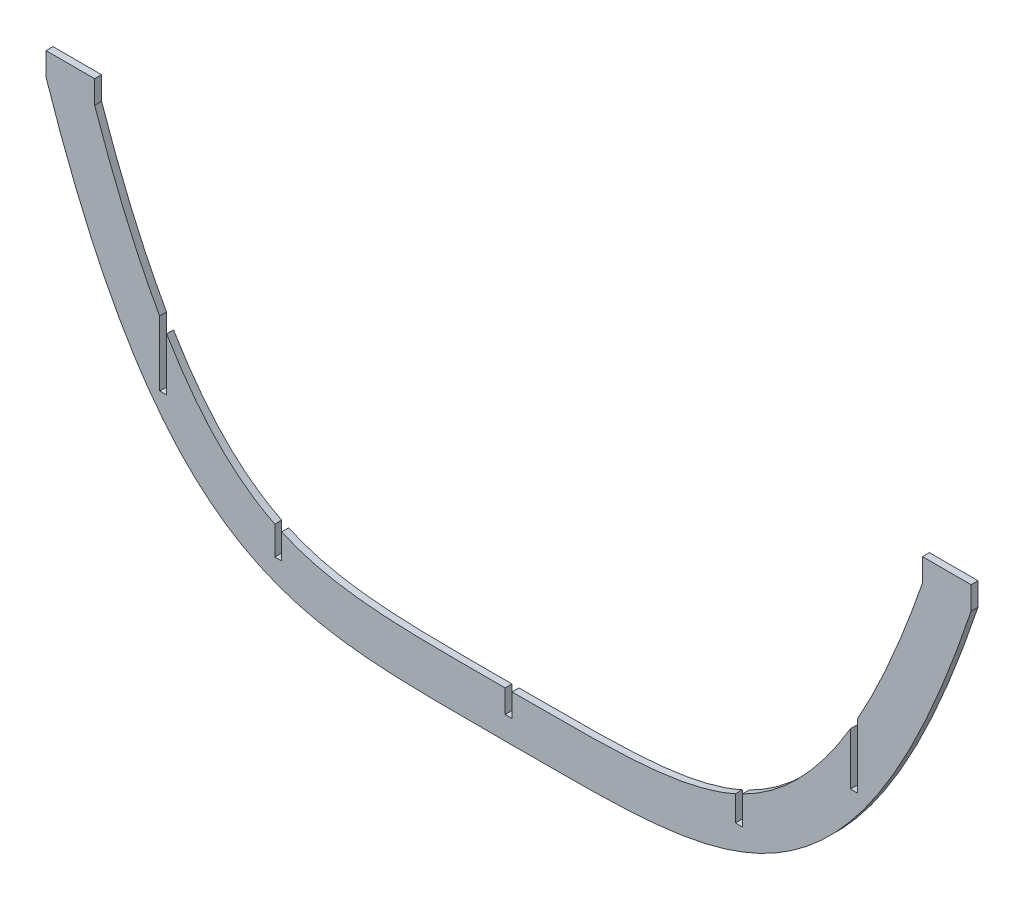
ISO-10303-21;
HEADER;
FILE_DESCRIPTION(('STEP AP214'),'2;1');
FILE_NAME('part.step','',(''),(''),'','','');
FILE_SCHEMA(('AUTOMOTIVE_DESIGN { 1 0 10303 214 1 1 1 1 }'));
ENDSEC;
DATA;
#1=APPLICATION_CONTEXT('core data for automotive mechanical design processes');
#2=APPLICATION_PROTOCOL_DEFINITION('international standard','automotive_design',2000,#1);
#3=PRODUCT_CONTEXT('',#1,'mechanical');
#4=PRODUCT('Part','Part','',(#3));
#5=PRODUCT_RELATED_PRODUCT_CATEGORY('part','',(#4));
#6=PRODUCT_DEFINITION_FORMATION('','',#4);
#7=PRODUCT_DEFINITION_CONTEXT('part definition',#1,'design');
#8=PRODUCT_DEFINITION('design','',#6,#7);
#9=PRODUCT_DEFINITION_SHAPE('','',#8);
#10=(LENGTH_UNIT() NAMED_UNIT(*) SI_UNIT(.MILLI.,.METRE.));
#11=(NAMED_UNIT(*) PLANE_ANGLE_UNIT() SI_UNIT($,.RADIAN.));
#12=(NAMED_UNIT(*) SI_UNIT($,.STERADIAN.) SOLID_ANGLE_UNIT());
#13=UNCERTAINTY_MEASURE_WITH_UNIT(LENGTH_MEASURE(1.E-05),#10,'distance_accuracy_value','');
#14=(GEOMETRIC_REPRESENTATION_CONTEXT(3) GLOBAL_UNCERTAINTY_ASSIGNED_CONTEXT((#13)) GLOBAL_UNIT_ASSIGNED_CONTEXT((#10,
#11,#12)) REPRESENTATION_CONTEXT('',''));
#15=CARTESIAN_POINT('',(0.,0.,0.));
#16=DIRECTION('',(0.,0.,1.));
#17=DIRECTION('',(1.,0.,0.));
#18=AXIS2_PLACEMENT_3D('',#15,#16,#17);
#19=CARTESIAN_POINT('',(-1.76484963795853E-08,20.0000268367312,3.));
#20=DIRECTION('',(0.,0.,-1.));
#21=DIRECTION('',(-1.,0.,0.));
#22=AXIS2_PLACEMENT_3D('',#19,#20,#21);
#23=PLANE('',#22);
#24=DIRECTION('',(0.,-1.,0.));
#25=VECTOR('',#24,1.);
#26=CARTESIAN_POINT('',(148.49999995567,20.0000268367312,3.));
#27=LINE('',#26,#25);
#28=CARTESIAN_POINT('',(148.499999955669,79.6816787201294,3.));
#29=VERTEX_POINT('',#28);
#30=CARTESIAN_POINT('',(148.49999995567,56.9497363309086,3.00000000000006));
#31=VERTEX_POINT('',#30);
#32=EDGE_CURVE('E231',#29,#31,#27,.T.);
#33=ORIENTED_EDGE('',*,*,#32,.F.);
#34=CARTESIAN_POINT('',(-181.89155674439,156.348940991431,3.));
#35=CARTESIAN_POINT('',(-181.389102539372,154.848010649401,3.));
#36=CARTESIAN_POINT('',(-180.365296683178,151.825275345379,3.));
#37=CARTESIAN_POINT('',(-178.341218670499,145.989784465338,3.));
#38=CARTESIAN_POINT('',(-175.809947010963,138.948890123025,3.));
#39=CARTESIAN_POINT('',(-172.785792832235,130.935125059408,3.));
#40=CARTESIAN_POINT('',(-168.767730488019,120.798325171274,3.));
#41=CARTESIAN_POINT('',(-163.77677392425,109.130604029288,3.));
#42=CARTESIAN_POINT('',(-157.84741355926,96.6329125765255,3.));
#43=CARTESIAN_POINT('',(-151.989218707979,85.5414270653508,3.));
#44=CARTESIAN_POINT('',(-144.288715251264,72.4973270246871,3.));
#45=CARTESIAN_POINT('',(-134.900658859617,59.2193290048783,3.));
#46=CARTESIAN_POINT('',(-124.086763070647,47.326306685615,3.));
#47=CARTESIAN_POINT('',(-113.706025746848,38.6442687840683,3.));
#48=CARTESIAN_POINT('',(-103.594307015774,32.3807774295716,3.));
#49=CARTESIAN_POINT('',(-93.4771216661665,27.8904041459694,3.));
#50=CARTESIAN_POINT('',(-83.0913857613406,24.726293951594,3.));
#51=CARTESIAN_POINT('',(-68.6850050786734,21.8783292872565,3.));
#52=CARTESIAN_POINT('',(-49.5163465659669,20.3042041838092,3.));
#53=CARTESIAN_POINT('',(-25.106587106077,19.9753145065531,3.));
#54=CARTESIAN_POINT('',(-1.77303726500037E-08,20.0123830018525,3.));
#55=CARTESIAN_POINT('',(25.1065870711075,19.9753145064242,3.));
#56=CARTESIAN_POINT('',(49.516346532462,20.3042041823506,3.));
#57=CARTESIAN_POINT('',(68.6850050471927,21.8783292829902,3.));
#58=CARTESIAN_POINT('',(83.0913857315635,24.7262939438739,3.));
#59=CARTESIAN_POINT('',(93.4771216374107,27.8904041349503,3.));
#60=CARTESIAN_POINT('',(103.594306987435,32.3807774142496,3.));
#61=CARTESIAN_POINT('',(113.706025718109,38.6442687629153,3.));
#62=CARTESIAN_POINT('',(124.086763040856,47.3263066565674,3.));
#63=CARTESIAN_POINT('',(134.900658828536,59.2193289656163,3.));
#64=CARTESIAN_POINT('',(144.288715219207,72.4973269750005,3.));
#65=CARTESIAN_POINT('',(151.989218675275,85.5414270062223,3.));
#66=CARTESIAN_POINT('',(157.84741352614,96.6329125097693,3.));
#67=CARTESIAN_POINT('',(163.776773890781,109.130603954358,3.));
#68=CARTESIAN_POINT('',(168.76773045431,120.798325089073,3.));
#69=CARTESIAN_POINT('',(172.785792798362,130.93512497111,3.));
#70=CARTESIAN_POINT('',(175.80994697698,138.948890030013,3.));
#71=CARTESIAN_POINT('',(178.341218636433,145.989784368273,3.));
#72=CARTESIAN_POINT('',(180.365296649052,151.825275245008,3.));
#73=CARTESIAN_POINT('',(181.389102505218,154.848010547339,3.));
#74=CARTESIAN_POINT('',(181.891556710222,156.348940888529,3.));
#75=B_SPLINE_CURVE_WITH_KNOTS('',3,(#34,#35,#36,#37,#38,#39,#40,#41,#42,#43,#44,#45,#46,#47,#48,
#49,#50,#51,#52,#53,#54,#55,#56,#57,#58,#59,#60,#61,#62,#63,#64,#65,#66,#67,#68,#69,#70,#71,#72,
#73,#74),.UNSPECIFIED.,.F.,.F.,(4,1,1,1,1,1,1,1,1,1,1,1,1,1,1,1,1,1,1,1,1,1,1,1,1,1,1,1,1,1,1,1,
1,1,1,1,1,1,4),(0.0367876297195018,0.0404064763620018,0.0440253230045017,0.0512630162895017,
0.0585007095745016,0.0657384028595015,0.0802137894295014,0.0946891759995013,0.109164562569501,
0.123639949139501,0.152590722279501,0.181541495419501,0.2104922685595,0.2394430416995,
0.2683938148395,0.2973445879795,0.326295361119499,0.384196907399499,0.442098453679498,
0.499999999959498,0.557901546239498,0.615803092519497,0.673704638799496,0.702655411939496,
0.731606185079496,0.760556958219496,0.789507731359496,0.818458504499495,0.847409277639495,
0.876360050779495,0.890835437349495,0.905310823919495,0.919786210489494,0.934261597059494,
0.941499290344494,0.948736983629494,0.955974676914494,0.959593523556994,0.963212370199494),.UNSPECIFIED.);
#76=CARTESIAN_POINT('',(101.49999995567,31.6009972758301,3.));
#77=VERTEX_POINT('',#76);
#78=EDGE_CURVE('E559',#77,#29,#75,.T.);
#79=ORIENTED_EDGE('',*,*,#78,.F.);
#80=DIRECTION('',(0.,1.,0.));
#81=VECTOR('',#80,1.);
#82=CARTESIAN_POINT('',(101.49999995567,20.0000268367312,3.));
#83=LINE('',#82,#81);
#84=CARTESIAN_POINT('',(101.49999995567,19.2159999834407,3.));
#85=VERTEX_POINT('',#84);
#86=EDGE_CURVE('E331',#85,#77,#83,.T.);
#87=ORIENTED_EDGE('',*,*,#86,.F.);
#88=DIRECTION('',(1.,0.,0.));
#89=VECTOR('',#88,1.);
#90=CARTESIAN_POINT('',(-1.76484963795853E-08,19.2159999834407,3.));
#91=LINE('',#90,#89);
#92=CARTESIAN_POINT('',(98.4999999556695,19.2159999834407,3.));
#93=VERTEX_POINT('',#92);
#94=EDGE_CURVE('E338',#93,#85,#91,.T.);
#95=ORIENTED_EDGE('',*,*,#94,.F.);
#96=DIRECTION('',(0.,-1.,0.));
#97=VECTOR('',#96,1.);
#98=CARTESIAN_POINT('',(98.4999999556695,20.0000268367312,3.));
#99=LINE('',#98,#97);
#100=CARTESIAN_POINT('',(98.4999999556695,30.1867286716392,3.));
#101=VERTEX_POINT('',#100);
#102=EDGE_CURVE('E341',#101,#93,#99,.T.);
#103=ORIENTED_EDGE('',*,*,#102,.F.);
#104=CARTESIAN_POINT('',(1.49999990680117,19.9999101597159,3.));
#105=VERTEX_POINT('',#104);
#106=EDGE_CURVE('E404',#105,#101,#75,.T.);
#107=ORIENTED_EDGE('',*,*,#106,.F.);
#108=DIRECTION('',(0.,1.,0.));
#109=VECTOR('',#108,1.);
#110=CARTESIAN_POINT('',(1.49999990680117,20.0000268367312,3.));
#111=LINE('',#110,#109);
#112=CARTESIAN_POINT('',(1.49999990680117,10.0000134183656,3.));
#113=VERTEX_POINT('',#112);
#114=EDGE_CURVE('E373',#113,#105,#111,.T.);
#115=ORIENTED_EDGE('',*,*,#114,.F.);
#116=DIRECTION('',(1.,0.,0.));
#117=VECTOR('',#116,1.);
#118=CARTESIAN_POINT('',(-1.76484963795853E-08,10.0000134183656,3.));
#119=LINE('',#118,#117);
#120=CARTESIAN_POINT('',(-1.49999999546217,10.0000134183656,3.));
#121=VERTEX_POINT('',#120);
#122=EDGE_CURVE('E363',#121,#113,#119,.T.);
#123=ORIENTED_EDGE('',*,*,#122,.F.);
#124=DIRECTION('',(0.,-1.,0.));
#125=VECTOR('',#124,1.);
#126=CARTESIAN_POINT('',(-1.49999999546217,20.0000268367312,3.));
#127=LINE('',#126,#125);
#128=CARTESIAN_POINT('',(-1.49999999546217,19.9999101597144,3.));
#129=VERTEX_POINT('',#128);
#130=EDGE_CURVE('E366',#129,#121,#127,.T.);
#131=ORIENTED_EDGE('',*,*,#130,.F.);
#132=CARTESIAN_POINT('',(-98.5000000000001,30.1867286962629,3.));
#133=VERTEX_POINT('',#132);
#134=EDGE_CURVE('E562',#133,#129,#75,.T.);
#135=ORIENTED_EDGE('',*,*,#134,.F.);
#136=DIRECTION('',(0.,1.,0.));
#137=VECTOR('',#136,1.);
#138=CARTESIAN_POINT('',(-98.5000000000001,20.0000268367312,3.));
#139=LINE('',#138,#137);
#140=CARTESIAN_POINT('',(-98.5000000000001,19.2160000001447,3.));
#141=VERTEX_POINT('',#140);
#142=EDGE_CURVE('E312',#141,#133,#139,.T.);
#143=ORIENTED_EDGE('',*,*,#142,.F.);
#144=DIRECTION('',(1.,0.,0.));
#145=VECTOR('',#144,1.);
#146=CARTESIAN_POINT('',(-1.76484963795853E-08,19.2160000001447,3.));
#147=LINE('',#146,#145);
#148=CARTESIAN_POINT('',(-101.5,19.2160000001447,3.));
#149=VERTEX_POINT('',#148);
#150=EDGE_CURVE('E315',#149,#141,#147,.T.);
#151=ORIENTED_EDGE('',*,*,#150,.F.);
#152=DIRECTION('',(0.,-1.,0.));
#153=VECTOR('',#152,1.);
#154=CARTESIAN_POINT('',(-101.5,20.0000268367312,3.));
#155=LINE('',#154,#153);
#156=CARTESIAN_POINT('',(-101.5,31.6009972982433,3.));
#157=VERTEX_POINT('',#156);
#158=EDGE_CURVE('E309',#157,#149,#155,.T.);
#159=ORIENTED_EDGE('',*,*,#158,.F.);
#160=CARTESIAN_POINT('',(-148.5,79.6816787949888,3.));
#161=VERTEX_POINT('',#160);
#162=EDGE_CURVE('E403',#161,#157,#75,.T.);
#163=ORIENTED_EDGE('',*,*,#162,.F.);
#164=DIRECTION('',(0.,1.,0.));
#165=VECTOR('',#164,1.);
#166=CARTESIAN_POINT('',(-148.5,20.0000268367312,3.));
#167=LINE('',#166,#165);
#168=CARTESIAN_POINT('',(-148.5,56.6560000001881,3.));
#169=VERTEX_POINT('',#168);
#170=EDGE_CURVE('E62',#169,#161,#167,.T.);
#171=ORIENTED_EDGE('',*,*,#170,.F.);
#172=DIRECTION('',(1.,0.,0.));
#173=VECTOR('',#172,1.);
#174=CARTESIAN_POINT('',(-1.76484963795853E-08,56.6560000001881,3.));
#175=LINE('',#174,#173);
#176=CARTESIAN_POINT('',(-151.5,56.6560000001881,3.));
#177=VERTEX_POINT('',#176);
#178=EDGE_CURVE('E288',#177,#169,#175,.T.);
#179=ORIENTED_EDGE('',*,*,#178,.F.);
#180=DIRECTION('',(0.,-1.,0.));
#181=VECTOR('',#180,1.);
#182=CARTESIAN_POINT('',(-151.5,20.0000268367312,3.));
#183=LINE('',#182,#181);
#184=CARTESIAN_POINT('',(-151.5,84.861233967771,3.));
#185=VERTEX_POINT('',#184);
#186=EDGE_CURVE('E285',#185,#177,#183,.T.);
#187=ORIENTED_EDGE('',*,*,#186,.F.);
#188=CARTESIAN_POINT('',(-179.730541016955,149.999999952136,3.));
#189=VERTEX_POINT('',#188);
#190=EDGE_CURVE('E395',#189,#185,#75,.T.);
#191=ORIENTED_EDGE('',*,*,#190,.F.);
#192=DIRECTION('',(0.,-1.,0.));
#193=VECTOR('',#192,1.);
#194=CARTESIAN_POINT('',(-179.730541016862,159.999999933328,3.));
#195=LINE('',#194,#193);
#196=CARTESIAN_POINT('',(-179.730541016862,159.999999933328,3.));
#197=VERTEX_POINT('',#196);
#198=EDGE_CURVE('E390',#197,#189,#195,.T.);
#199=ORIENTED_EDGE('',*,*,#198,.F.);
#200=DIRECTION('',(1.,0.,0.));
#201=VECTOR('',#200,1.);
#202=CARTESIAN_POINT('',(-200.857104713773,159.999999933328,3.));
#203=LINE('',#202,#201);
#204=CARTESIAN_POINT('',(-200.857104713773,159.999999933328,3.));
#205=VERTEX_POINT('',#204);
#206=EDGE_CURVE('E385',#205,#197,#203,.T.);
#207=ORIENTED_EDGE('',*,*,#206,.F.);
#208=DIRECTION('',(0.,1.,0.));
#209=VECTOR('',#208,1.);
#210=CARTESIAN_POINT('',(-200.857104713773,149.999999933328,3.));
#211=LINE('',#210,#209);
#212=CARTESIAN_POINT('',(-200.857104713153,149.999999931476,3.));
#213=VERTEX_POINT('',#212);
#214=EDGE_CURVE('E381',#213,#205,#211,.T.);
#215=ORIENTED_EDGE('',*,*,#214,.F.);
#216=CARTESIAN_POINT('',(-200.857104713153,149.999999931476,3.));
#217=CARTESIAN_POINT('',(-100.428552365603,-149.999999904114,3.));
#218=CARTESIAN_POINT('',(-1.80532342547446E-08,149.999999877385,3.));
#219=CARTESIAN_POINT('',(100.428552329497,-149.999999850558,3.));
#220=CARTESIAN_POINT('',(200.857104677046,149.999999822903,3.));
#221=B_SPLINE_CURVE_WITH_KNOTS('',4,(#216,#217,#218,#219,#220),.UNSPECIFIED.,.F.,.F.,(5,5),
(0.036787629720932,0.9632123701958),.UNSPECIFIED.);
#222=CARTESIAN_POINT('',(200.857104677046,149.999999822903,3.));
#223=VERTEX_POINT('',#222);
#224=EDGE_CURVE('E449',#213,#223,#221,.T.);
#225=ORIENTED_EDGE('',*,*,#224,.T.);
#226=DIRECTION('',(0.,1.,0.));
#227=VECTOR('',#226,1.);
#228=CARTESIAN_POINT('',(200.857104678648,149.999999827688,3.));
#229=LINE('',#228,#227);
#230=CARTESIAN_POINT('',(200.857104678648,159.999999832473,3.));
#231=VERTEX_POINT('',#230);
#232=EDGE_CURVE('E457',#223,#231,#229,.T.);
#233=ORIENTED_EDGE('',*,*,#232,.T.);
#234=DIRECTION('',(-1.,0.,0.));
#235=VECTOR('',#234,1.);
#236=CARTESIAN_POINT('',(200.857104678648,159.999999832473,3.));
#237=LINE('',#236,#235);
#238=CARTESIAN_POINT('',(179.730540975813,159.999999832473,3.));
#239=VERTEX_POINT('',#238);
#240=EDGE_CURVE('E631',#231,#239,#237,.T.);
#241=ORIENTED_EDGE('',*,*,#240,.T.);
#242=DIRECTION('',(0.,-1.,0.));
#243=VECTOR('',#242,1.);
#244=CARTESIAN_POINT('',(179.730540975813,159.999999832473,3.));
#245=LINE('',#244,#243);
#246=CARTESIAN_POINT('',(179.730540975813,149.999999832476,3.));
#247=VERTEX_POINT('',#246);
#248=EDGE_CURVE('E402',#239,#247,#245,.T.);
#249=ORIENTED_EDGE('',*,*,#248,.T.);
#250=CARTESIAN_POINT('',(151.49999995567,84.8612338884335,3.));
#251=VERTEX_POINT('',#250);
#252=EDGE_CURVE('E394',#251,#247,#75,.T.);
#253=ORIENTED_EDGE('',*,*,#252,.F.);
#254=DIRECTION('',(0.,1.,0.));
#255=VECTOR('',#254,1.);
#256=CARTESIAN_POINT('',(151.49999995567,20.0000268367312,3.));
#257=LINE('',#256,#255);
#258=CARTESIAN_POINT('',(151.49999995567,56.9497363309086,3.00000000000006));
#259=VERTEX_POINT('',#258);
#260=EDGE_CURVE('E54',#259,#251,#257,.T.);
#261=ORIENTED_EDGE('',*,*,#260,.F.);
#262=DIRECTION('',(1.,0.,0.));
#263=VECTOR('',#262,1.);
#264=CARTESIAN_POINT('',(-1.76484963795853E-08,56.9497363309086,3.));
#265=LINE('',#264,#263);
#266=EDGE_CURVE('E262',#31,#259,#265,.T.);
#267=ORIENTED_EDGE('',*,*,#266,.F.);
#268=EDGE_LOOP('',(#33,#79,#87,#95,#103,#107,#115,#123,#131,#135,#143,#151,#159,#163,#171,#179,
#187,#191,#199,#207,#215,#225,#233,#241,#249,#253,#261,#267));
#269=FACE_BOUND('',#268,.T.);
#270=ADVANCED_FACE('F38',(#269),#23,.F.);
#271=CARTESIAN_POINT('',(-1.76484963795853E-08,20.0000268367312,0.));
#272=DIRECTION('',(0.,0.,-1.));
#273=DIRECTION('',(-1.,0.,0.));
#274=AXIS2_PLACEMENT_3D('',#271,#272,#273);
#275=PLANE('',#274);
#276=CARTESIAN_POINT('',(-181.89155674439,156.348940991431,0.));
#277=CARTESIAN_POINT('',(-181.389102539372,154.848010649401,0.));
#278=CARTESIAN_POINT('',(-180.365296683178,151.825275345379,0.));
#279=CARTESIAN_POINT('',(-178.341218670499,145.989784465338,0.));
#280=CARTESIAN_POINT('',(-175.809947010963,138.948890123025,0.));
#281=CARTESIAN_POINT('',(-172.785792832235,130.935125059408,0.));
#282=CARTESIAN_POINT('',(-168.767730488019,120.798325171274,0.));
#283=CARTESIAN_POINT('',(-163.77677392425,109.130604029288,0.));
#284=CARTESIAN_POINT('',(-157.84741355926,96.6329125765255,0.));
#285=CARTESIAN_POINT('',(-151.989218707979,85.5414270653508,0.));
#286=CARTESIAN_POINT('',(-144.288715251264,72.4973270246871,0.));
#287=CARTESIAN_POINT('',(-134.900658859617,59.2193290048783,0.));
#288=CARTESIAN_POINT('',(-124.086763070647,47.326306685615,0.));
#289=CARTESIAN_POINT('',(-113.706025746848,38.6442687840683,0.));
#290=CARTESIAN_POINT('',(-103.594307015774,32.3807774295716,0.));
#291=CARTESIAN_POINT('',(-93.4771216661665,27.8904041459694,0.));
#292=CARTESIAN_POINT('',(-83.0913857613406,24.726293951594,0.));
#293=CARTESIAN_POINT('',(-68.6850050786734,21.8783292872565,0.));
#294=CARTESIAN_POINT('',(-49.5163465659669,20.3042041838092,0.));
#295=CARTESIAN_POINT('',(-25.106587106077,19.9753145065531,0.));
#296=CARTESIAN_POINT('',(-1.77303726500037E-08,20.0123830018525,0.));
#297=CARTESIAN_POINT('',(25.1065870711075,19.9753145064242,0.));
#298=CARTESIAN_POINT('',(49.516346532462,20.3042041823506,0.));
#299=CARTESIAN_POINT('',(68.6850050471927,21.8783292829902,0.));
#300=CARTESIAN_POINT('',(83.0913857315635,24.7262939438739,0.));
#301=CARTESIAN_POINT('',(93.4771216374107,27.8904041349503,0.));
#302=CARTESIAN_POINT('',(103.594306987435,32.3807774142496,0.));
#303=CARTESIAN_POINT('',(113.706025718109,38.6442687629153,0.));
#304=CARTESIAN_POINT('',(124.086763040856,47.3263066565674,0.));
#305=CARTESIAN_POINT('',(134.900658828536,59.2193289656163,0.));
#306=CARTESIAN_POINT('',(144.288715219207,72.4973269750005,0.));
#307=CARTESIAN_POINT('',(151.989218675275,85.5414270062223,0.));
#308=CARTESIAN_POINT('',(157.84741352614,96.6329125097693,0.));
#309=CARTESIAN_POINT('',(163.776773890781,109.130603954358,0.));
#310=CARTESIAN_POINT('',(168.76773045431,120.798325089073,0.));
#311=CARTESIAN_POINT('',(172.785792798362,130.93512497111,0.));
#312=CARTESIAN_POINT('',(175.80994697698,138.948890030013,0.));
#313=CARTESIAN_POINT('',(178.341218636433,145.989784368273,0.));
#314=CARTESIAN_POINT('',(180.365296649052,151.825275245008,0.));
#315=CARTESIAN_POINT('',(181.389102505218,154.848010547339,0.));
#316=CARTESIAN_POINT('',(181.891556710222,156.348940888529,0.));
#317=B_SPLINE_CURVE_WITH_KNOTS('',3,(#276,#277,#278,#279,#280,#281,#282,#283,#284,#285,#286,
#287,#288,#289,#290,#291,#292,#293,#294,#295,#296,#297,#298,#299,#300,#301,#302,#303,#304,#305,
#306,#307,#308,#309,#310,#311,#312,#313,#314,#315,#316),.UNSPECIFIED.,.F.,.F.,(4,1,1,1,1,1,1,1,
1,1,1,1,1,1,1,1,1,1,1,1,1,1,1,1,1,1,1,1,1,1,1,1,1,1,1,1,1,1,4),(0.0367876297195018,
0.0404064763620018,0.0440253230045017,0.0512630162895017,0.0585007095745016,0.0657384028595015,
0.0802137894295014,0.0946891759995013,0.109164562569501,0.123639949139501,0.152590722279501,
0.181541495419501,0.2104922685595,0.2394430416995,0.2683938148395,0.2973445879795,
0.326295361119499,0.384196907399499,0.442098453679498,0.499999999959498,0.557901546239498,
0.615803092519497,0.673704638799496,0.702655411939496,0.731606185079496,0.760556958219496,
0.789507731359496,0.818458504499495,0.847409277639495,0.876360050779495,0.890835437349495,
0.905310823919495,0.919786210489494,0.934261597059494,0.941499290344494,0.948736983629494,
0.955974676914494,0.959593523556994,0.963212370199494),.UNSPECIFIED.);
#318=CARTESIAN_POINT('',(101.499999955671,31.6009972758301,0.));
#319=VERTEX_POINT('',#318);
#320=CARTESIAN_POINT('',(148.49999995567,79.6816787201301,0.));
#321=VERTEX_POINT('',#320);
#322=EDGE_CURVE('E250',#319,#321,#317,.T.);
#323=ORIENTED_EDGE('',*,*,#322,.T.);
#324=DIRECTION('',(0.,-1.,0.));
#325=VECTOR('',#324,1.);
#326=CARTESIAN_POINT('',(148.49999995567,59.9497363309086,0.));
#327=LINE('',#326,#325);
#328=CARTESIAN_POINT('',(148.49999995567,56.9497363309086,0.));
#329=VERTEX_POINT('',#328);
#330=EDGE_CURVE('E229',#321,#329,#327,.T.);
#331=ORIENTED_EDGE('',*,*,#330,.T.);
#332=DIRECTION('',(1.,0.,0.));
#333=VECTOR('',#332,1.);
#334=CARTESIAN_POINT('',(148.49999995567,56.9497363309086,0.));
#335=LINE('',#334,#333);
#336=CARTESIAN_POINT('',(151.49999995567,56.9497363309086,0.));
#337=VERTEX_POINT('',#336);
#338=EDGE_CURVE('E238',#329,#337,#335,.T.);
#339=ORIENTED_EDGE('',*,*,#338,.T.);
#340=DIRECTION('',(0.,1.,0.));
#341=VECTOR('',#340,1.);
#342=CARTESIAN_POINT('',(151.49999995567,56.9497363309086,0.));
#343=LINE('',#342,#341);
#344=CARTESIAN_POINT('',(151.49999995567,84.8612338884414,0.));
#345=VERTEX_POINT('',#344);
#346=EDGE_CURVE('E244',#337,#345,#343,.T.);
#347=ORIENTED_EDGE('',*,*,#346,.T.);
#348=CARTESIAN_POINT('',(179.730540975813,149.999999832476,0.));
#349=VERTEX_POINT('',#348);
#350=EDGE_CURVE('E472',#345,#349,#317,.T.);
#351=ORIENTED_EDGE('',*,*,#350,.T.);
#352=DIRECTION('',(0.,-1.,0.));
#353=VECTOR('',#352,1.);
#354=CARTESIAN_POINT('',(179.730540975813,159.999999832473,0.));
#355=LINE('',#354,#353);
#356=CARTESIAN_POINT('',(179.730540975813,159.999999832473,0.));
#357=VERTEX_POINT('',#356);
#358=EDGE_CURVE('E479',#357,#349,#355,.T.);
#359=ORIENTED_EDGE('',*,*,#358,.F.);
#360=DIRECTION('',(-1.,0.,0.));
#361=VECTOR('',#360,1.);
#362=CARTESIAN_POINT('',(200.857104678648,159.999999832473,0.));
#363=LINE('',#362,#361);
#364=CARTESIAN_POINT('',(200.857104678648,159.999999832473,0.));
#365=VERTEX_POINT('',#364);
#366=EDGE_CURVE('E488',#365,#357,#363,.T.);
#367=ORIENTED_EDGE('',*,*,#366,.F.);
#368=DIRECTION('',(0.,1.,0.));
#369=VECTOR('',#368,1.);
#370=CARTESIAN_POINT('',(200.857104678648,149.999999827688,0.));
#371=LINE('',#370,#369);
#372=CARTESIAN_POINT('',(200.857104677046,149.999999822903,0.));
#373=VERTEX_POINT('',#372);
#374=EDGE_CURVE('E491',#373,#365,#371,.T.);
#375=ORIENTED_EDGE('',*,*,#374,.F.);
#376=CARTESIAN_POINT('',(-200.857104713153,149.999999931476,0.));
#377=CARTESIAN_POINT('',(-100.428552365603,-149.999999904114,0.));
#378=CARTESIAN_POINT('',(-1.80532342547446E-08,149.999999877385,0.));
#379=CARTESIAN_POINT('',(100.428552329497,-149.999999850558,0.));
#380=CARTESIAN_POINT('',(200.857104677046,149.999999822903,0.));
#381=B_SPLINE_CURVE_WITH_KNOTS('',4,(#376,#377,#378,#379,#380),.UNSPECIFIED.,.F.,.F.,(5,5),
(0.036787629720932,0.9632123701958),.UNSPECIFIED.);
#382=CARTESIAN_POINT('',(-200.857104713153,149.999999931476,0.));
#383=VERTEX_POINT('',#382);
#384=EDGE_CURVE('E386',#383,#373,#381,.T.);
#385=ORIENTED_EDGE('',*,*,#384,.F.);
#386=DIRECTION('',(0.,1.,0.));
#387=VECTOR('',#386,1.);
#388=CARTESIAN_POINT('',(-200.857104713773,149.999999933328,0.));
#389=LINE('',#388,#387);
#390=CARTESIAN_POINT('',(-200.857104713773,159.999999933328,0.));
#391=VERTEX_POINT('',#390);
#392=EDGE_CURVE('E380',#383,#391,#389,.T.);
#393=ORIENTED_EDGE('',*,*,#392,.T.);
#394=DIRECTION('',(1.,0.,0.));
#395=VECTOR('',#394,1.);
#396=CARTESIAN_POINT('',(-200.857104713773,159.999999933328,0.));
#397=LINE('',#396,#395);
#398=CARTESIAN_POINT('',(-179.730541016862,159.999999933328,0.));
#399=VERTEX_POINT('',#398);
#400=EDGE_CURVE('E464',#391,#399,#397,.T.);
#401=ORIENTED_EDGE('',*,*,#400,.T.);
#402=DIRECTION('',(0.,-1.,0.));
#403=VECTOR('',#402,1.);
#404=CARTESIAN_POINT('',(-179.730541016862,159.999999933328,0.));
#405=LINE('',#404,#403);
#406=CARTESIAN_POINT('',(-179.730541016955,149.999999952136,0.));
#407=VERTEX_POINT('',#406);
#408=EDGE_CURVE('E468',#399,#407,#405,.T.);
#409=ORIENTED_EDGE('',*,*,#408,.T.);
#410=CARTESIAN_POINT('',(-151.5,84.8612339677683,0.));
#411=VERTEX_POINT('',#410);
#412=EDGE_CURVE('E473',#407,#411,#317,.T.);
#413=ORIENTED_EDGE('',*,*,#412,.T.);
#414=DIRECTION('',(0.,-1.,0.));
#415=VECTOR('',#414,1.);
#416=CARTESIAN_POINT('',(-151.5,56.6560000001881,0.));
#417=LINE('',#416,#415);
#418=CARTESIAN_POINT('',(-151.5,56.6560000001881,0.));
#419=VERTEX_POINT('',#418);
#420=EDGE_CURVE('E265',#411,#419,#417,.T.);
#421=ORIENTED_EDGE('',*,*,#420,.T.);
#422=DIRECTION('',(1.,0.,0.));
#423=VECTOR('',#422,1.);
#424=CARTESIAN_POINT('',(-148.5,56.6560000001881,0.));
#425=LINE('',#424,#423);
#426=CARTESIAN_POINT('',(-148.5,56.6560000001881,0.));
#427=VERTEX_POINT('',#426);
#428=EDGE_CURVE('E269',#419,#427,#425,.T.);
#429=ORIENTED_EDGE('',*,*,#428,.T.);
#430=DIRECTION('',(0.,1.,0.));
#431=VECTOR('',#430,1.);
#432=CARTESIAN_POINT('',(-148.5,56.6560000001881,0.));
#433=LINE('',#432,#431);
#434=CARTESIAN_POINT('',(-148.5,79.681678811326,0.));
#435=VERTEX_POINT('',#434);
#436=EDGE_CURVE('E273',#427,#435,#433,.T.);
#437=ORIENTED_EDGE('',*,*,#436,.T.);
#438=CARTESIAN_POINT('',(-101.5,31.6009972982433,0.));
#439=VERTEX_POINT('',#438);
#440=EDGE_CURVE('E480',#435,#439,#317,.T.);
#441=ORIENTED_EDGE('',*,*,#440,.T.);
#442=DIRECTION('',(0.,-1.,0.));
#443=VECTOR('',#442,1.);
#444=CARTESIAN_POINT('',(-101.5,19.2160000001447,0.));
#445=LINE('',#444,#443);
#446=CARTESIAN_POINT('',(-101.5,19.2160000001447,0.));
#447=VERTEX_POINT('',#446);
#448=EDGE_CURVE('E295',#439,#447,#445,.T.);
#449=ORIENTED_EDGE('',*,*,#448,.T.);
#450=DIRECTION('',(1.,0.,0.));
#451=VECTOR('',#450,1.);
#452=CARTESIAN_POINT('',(-98.5000000000001,19.2160000001447,0.));
#453=LINE('',#452,#451);
#454=CARTESIAN_POINT('',(-98.5000000000001,19.2160000001447,0.));
#455=VERTEX_POINT('',#454);
#456=EDGE_CURVE('E299',#447,#455,#453,.T.);
#457=ORIENTED_EDGE('',*,*,#456,.T.);
#458=DIRECTION('',(0.,1.,0.));
#459=VECTOR('',#458,1.);
#460=CARTESIAN_POINT('',(-98.5000000000001,19.2160000001447,0.));
#461=LINE('',#460,#459);
#462=CARTESIAN_POINT('',(-98.5000000000001,30.1867286962606,0.));
#463=VERTEX_POINT('',#462);
#464=EDGE_CURVE('E291',#455,#463,#461,.T.);
#465=ORIENTED_EDGE('',*,*,#464,.T.);
#466=CARTESIAN_POINT('',(-1.49999999546217,19.9999101597144,0.));
#467=VERTEX_POINT('',#466);
#468=EDGE_CURVE('E590',#463,#467,#317,.T.);
#469=ORIENTED_EDGE('',*,*,#468,.T.);
#470=DIRECTION('',(0.,-1.,0.));
#471=VECTOR('',#470,1.);
#472=CARTESIAN_POINT('',(-1.49999999546217,20.0000268367312,0.));
#473=LINE('',#472,#471);
#474=CARTESIAN_POINT('',(-1.49999999546217,10.0000134183656,0.));
#475=VERTEX_POINT('',#474);
#476=EDGE_CURVE('E504',#467,#475,#473,.T.);
#477=ORIENTED_EDGE('',*,*,#476,.T.);
#478=DIRECTION('',(1.,0.,0.));
#479=VECTOR('',#478,1.);
#480=CARTESIAN_POINT('',(1.49999990680117,10.0000134183656,0.));
#481=LINE('',#480,#479);
#482=CARTESIAN_POINT('',(1.49999990680117,10.0000134183656,0.));
#483=VERTEX_POINT('',#482);
#484=EDGE_CURVE('E352',#475,#483,#481,.T.);
#485=ORIENTED_EDGE('',*,*,#484,.T.);
#486=DIRECTION('',(0.,1.,0.));
#487=VECTOR('',#486,1.);
#488=CARTESIAN_POINT('',(1.49999990680117,10.0000134183656,0.));
#489=LINE('',#488,#487);
#490=CARTESIAN_POINT('',(1.49999990680117,19.9999101597159,0.));
#491=VERTEX_POINT('',#490);
#492=EDGE_CURVE('E348',#483,#491,#489,.T.);
#493=ORIENTED_EDGE('',*,*,#492,.T.);
#494=CARTESIAN_POINT('',(98.4999999556695,30.1867286716392,0.));
#495=VERTEX_POINT('',#494);
#496=EDGE_CURVE('E481',#491,#495,#317,.T.);
#497=ORIENTED_EDGE('',*,*,#496,.T.);
#498=DIRECTION('',(0.,-1.,0.));
#499=VECTOR('',#498,1.);
#500=CARTESIAN_POINT('',(98.4999999556695,20.0000268367312,0.));
#501=LINE('',#500,#499);
#502=CARTESIAN_POINT('',(98.4999999556695,19.2159999834407,0.));
#503=VERTEX_POINT('',#502);
#504=EDGE_CURVE('E532',#495,#503,#501,.T.);
#505=ORIENTED_EDGE('',*,*,#504,.T.);
#506=DIRECTION('',(1.,0.,0.));
#507=VECTOR('',#506,1.);
#508=CARTESIAN_POINT('',(101.49999995567,19.2159999834407,0.));
#509=LINE('',#508,#507);
#510=CARTESIAN_POINT('',(101.49999995567,19.2159999834407,0.));
#511=VERTEX_POINT('',#510);
#512=EDGE_CURVE('E318',#503,#511,#509,.T.);
#513=ORIENTED_EDGE('',*,*,#512,.T.);
#514=DIRECTION('',(0.,1.,0.));
#515=VECTOR('',#514,1.);
#516=CARTESIAN_POINT('',(101.49999995567,19.2159999834407,0.));
#517=LINE('',#516,#515);
#518=EDGE_CURVE('E322',#511,#319,#517,.T.);
#519=ORIENTED_EDGE('',*,*,#518,.T.);
#520=EDGE_LOOP('',(#323,#331,#339,#347,#351,#359,#367,#375,#385,#393,#401,#409,#413,#421,#429,
#437,#441,#449,#457,#465,#469,#477,#485,#493,#497,#505,#513,#519));
#521=FACE_BOUND('',#520,.T.);
#522=ADVANCED_FACE('F247',(#521),#275,.T.);
#523=DIRECTION('',(0.,0.,-1.));
#524=VECTOR('',#523,1.);
#525=SURFACE_OF_LINEAR_EXTRUSION('',#75,#524);
#526=ORIENTED_EDGE('',*,*,#78,.T.);
#527=DIRECTION('',(0.,0.,-1.));
#528=VECTOR('',#527,1.);
#529=CARTESIAN_POINT('',(148.499999955669,79.6816787201294,3.));
#530=LINE('',#529,#528);
#531=EDGE_CURVE('E11',#29,#321,#530,.T.);
#532=ORIENTED_EDGE('',*,*,#531,.T.);
#533=ORIENTED_EDGE('',*,*,#322,.F.);
#534=DIRECTION('',(0.,0.,-1.));
#535=VECTOR('',#534,1.);
#536=CARTESIAN_POINT('',(101.49999995567,31.6009972758292,3.));
#537=LINE('',#536,#535);
#538=EDGE_CURVE('E334',#319,#77,#537,.F.);
#539=ORIENTED_EDGE('',*,*,#538,.T.);
#540=EDGE_LOOP('',(#526,#532,#533,#539));
#541=FACE_BOUND('',#540,.T.);
#542=ADVANCED_FACE('F416',(#541),#525,.T.);
#543=ORIENTED_EDGE('',*,*,#350,.F.);
#544=DIRECTION('',(0.,0.,-1.));
#545=VECTOR('',#544,1.);
#546=CARTESIAN_POINT('',(151.49999995567,84.8612338884335,3.));
#547=LINE('',#546,#545);
#548=EDGE_CURVE('E47',#345,#251,#547,.F.);
#549=ORIENTED_EDGE('',*,*,#548,.T.);
#550=ORIENTED_EDGE('',*,*,#252,.T.);
#551=DIRECTION('',(0.,0.,-1.));
#552=VECTOR('',#551,1.);
#553=CARTESIAN_POINT('',(179.730540975813,149.999999832476,3.));
#554=LINE('',#553,#552);
#555=EDGE_CURVE('E517',#247,#349,#554,.T.);
#556=ORIENTED_EDGE('',*,*,#555,.T.);
#557=EDGE_LOOP('',(#543,#549,#550,#556));
#558=FACE_BOUND('',#557,.T.);
#559=ADVANCED_FACE('F554',(#558),#525,.T.);
#560=ORIENTED_EDGE('',*,*,#190,.T.);
#561=DIRECTION('',(0.,0.,-1.));
#562=VECTOR('',#561,1.);
#563=CARTESIAN_POINT('',(-151.5,84.861233967771,3.));
#564=LINE('',#563,#562);
#565=EDGE_CURVE('E547',#185,#411,#564,.T.);
#566=ORIENTED_EDGE('',*,*,#565,.T.);
#567=ORIENTED_EDGE('',*,*,#412,.F.);
#568=DIRECTION('',(0.,0.,-1.));
#569=VECTOR('',#568,1.);
#570=CARTESIAN_POINT('',(-179.730541016955,149.999999952136,3.));
#571=LINE('',#570,#569);
#572=EDGE_CURVE('E521',#189,#407,#571,.T.);
#573=ORIENTED_EDGE('',*,*,#572,.F.);
#574=EDGE_LOOP('',(#560,#566,#567,#573));
#575=FACE_BOUND('',#574,.T.);
#576=ADVANCED_FACE('F606',(#575),#525,.T.);
#577=ORIENTED_EDGE('',*,*,#440,.F.);
#578=DIRECTION('',(0.,0.,-1.));
#579=VECTOR('',#578,1.);
#580=CARTESIAN_POINT('',(-148.5,79.6816787949888,3.));
#581=LINE('',#580,#579);
#582=EDGE_CURVE('E544',#435,#161,#581,.F.);
#583=ORIENTED_EDGE('',*,*,#582,.T.);
#584=ORIENTED_EDGE('',*,*,#162,.T.);
#585=DIRECTION('',(0.,0.,-1.));
#586=VECTOR('',#585,1.);
#587=CARTESIAN_POINT('',(-101.5,31.6009972982433,3.));
#588=LINE('',#587,#586);
#589=EDGE_CURVE('E536',#157,#439,#588,.T.);
#590=ORIENTED_EDGE('',*,*,#589,.T.);
#591=EDGE_LOOP('',(#577,#583,#584,#590));
#592=FACE_BOUND('',#591,.T.);
#593=ADVANCED_FACE('F604',(#592),#525,.T.);
#594=ORIENTED_EDGE('',*,*,#468,.F.);
#595=DIRECTION('',(0.,0.,-1.));
#596=VECTOR('',#595,1.);
#597=CARTESIAN_POINT('',(-98.5000000000001,30.1867286962629,3.));
#598=LINE('',#597,#596);
#599=EDGE_CURVE('E540',#463,#133,#598,.F.);
#600=ORIENTED_EDGE('',*,*,#599,.T.);
#601=ORIENTED_EDGE('',*,*,#134,.T.);
#602=DIRECTION('',(0.,0.,-1.));
#603=VECTOR('',#602,1.);
#604=CARTESIAN_POINT('',(-1.49999999546217,19.9999101597159,3.));
#605=LINE('',#604,#603);
#606=EDGE_CURVE('E369',#129,#467,#605,.T.);
#607=ORIENTED_EDGE('',*,*,#606,.T.);
#608=EDGE_LOOP('',(#594,#600,#601,#607));
#609=FACE_BOUND('',#608,.T.);
#610=ADVANCED_FACE('F414',(#609),#525,.T.);
#611=ORIENTED_EDGE('',*,*,#106,.T.);
#612=DIRECTION('',(0.,0.,-1.));
#613=VECTOR('',#612,1.);
#614=CARTESIAN_POINT('',(98.4999999556695,30.1867286760045,3.));
#615=LINE('',#614,#613);
#616=EDGE_CURVE('E344',#101,#495,#615,.T.);
#617=ORIENTED_EDGE('',*,*,#616,.T.);
#618=ORIENTED_EDGE('',*,*,#496,.F.);
#619=DIRECTION('',(0.,0.,-1.));
#620=VECTOR('',#619,1.);
#621=CARTESIAN_POINT('',(1.49999990680117,19.9999101597159,3.));
#622=LINE('',#621,#620);
#623=EDGE_CURVE('E376',#491,#105,#622,.F.);
#624=ORIENTED_EDGE('',*,*,#623,.T.);
#625=EDGE_LOOP('',(#611,#617,#618,#624));
#626=FACE_BOUND('',#625,.T.);
#627=ADVANCED_FACE('F410',(#626),#525,.T.);
#628=CARTESIAN_POINT('',(-200.857104713773,149.999999933328,3.));
#629=DIRECTION('',(-1.,0.,0.));
#630=DIRECTION('',(0.,0.,1.));
#631=AXIS2_PLACEMENT_3D('',#628,#629,#630);
#632=PLANE('',#631);
#633=ORIENTED_EDGE('',*,*,#392,.F.);
#634=DIRECTION('',(0.,0.,-1.));
#635=VECTOR('',#634,1.);
#636=CARTESIAN_POINT('',(-200.857104713153,149.999999931476,3.));
#637=LINE('',#636,#635);
#638=EDGE_CURVE('E498',#213,#383,#637,.T.);
#639=ORIENTED_EDGE('',*,*,#638,.F.);
#640=ORIENTED_EDGE('',*,*,#214,.T.);
#641=DIRECTION('',(0.,0.,-1.));
#642=VECTOR('',#641,1.);
#643=CARTESIAN_POINT('',(-200.857104713773,159.999999933328,3.));
#644=LINE('',#643,#642);
#645=EDGE_CURVE('E456',#205,#391,#644,.T.);
#646=ORIENTED_EDGE('',*,*,#645,.T.);
#647=EDGE_LOOP('',(#633,#639,#640,#646));
#648=FACE_BOUND('',#647,.T.);
#649=ADVANCED_FACE('F40',(#648),#632,.T.);
#650=DIRECTION('',(0.,0.,-1.));
#651=VECTOR('',#650,1.);
#652=SURFACE_OF_LINEAR_EXTRUSION('',#221,#651);
#653=ORIENTED_EDGE('',*,*,#384,.T.);
#654=DIRECTION('',(0.,0.,-1.));
#655=VECTOR('',#654,1.);
#656=CARTESIAN_POINT('',(200.857104677046,149.999999822903,3.));
#657=LINE('',#656,#655);
#658=EDGE_CURVE('E505',#223,#373,#657,.T.);
#659=ORIENTED_EDGE('',*,*,#658,.F.);
#660=ORIENTED_EDGE('',*,*,#224,.F.);
#661=ORIENTED_EDGE('',*,*,#638,.T.);
#662=EDGE_LOOP('',(#653,#659,#660,#661));
#663=FACE_BOUND('',#662,.T.);
#664=ADVANCED_FACE('F443',(#663),#652,.F.);
#665=CARTESIAN_POINT('',(200.857104678648,149.999999827688,3.));
#666=DIRECTION('',(-1.,0.,0.));
#667=DIRECTION('',(0.,0.,1.));
#668=AXIS2_PLACEMENT_3D('',#665,#666,#667);
#669=PLANE('',#668);
#670=ORIENTED_EDGE('',*,*,#374,.T.);
#671=DIRECTION('',(0.,0.,-1.));
#672=VECTOR('',#671,1.);
#673=CARTESIAN_POINT('',(200.857104678648,159.999999832473,3.));
#674=LINE('',#673,#672);
#675=EDGE_CURVE('E509',#231,#365,#674,.T.);
#676=ORIENTED_EDGE('',*,*,#675,.F.);
#677=ORIENTED_EDGE('',*,*,#232,.F.);
#678=ORIENTED_EDGE('',*,*,#658,.T.);
#679=EDGE_LOOP('',(#670,#676,#677,#678));
#680=FACE_BOUND('',#679,.T.);
#681=ADVANCED_FACE('F447',(#680),#669,.F.);
#682=CARTESIAN_POINT('',(200.857104678648,159.999999832473,3.));
#683=DIRECTION('',(0.,-1.,0.));
#684=DIRECTION('',(0.,0.,-1.));
#685=AXIS2_PLACEMENT_3D('',#682,#683,#684);
#686=PLANE('',#685);
#687=ORIENTED_EDGE('',*,*,#366,.T.);
#688=DIRECTION('',(0.,0.,-1.));
#689=VECTOR('',#688,1.);
#690=CARTESIAN_POINT('',(179.730540975813,159.999999832473,3.));
#691=LINE('',#690,#689);
#692=EDGE_CURVE('E513',#239,#357,#691,.T.);
#693=ORIENTED_EDGE('',*,*,#692,.F.);
#694=ORIENTED_EDGE('',*,*,#240,.F.);
#695=ORIENTED_EDGE('',*,*,#675,.T.);
#696=EDGE_LOOP('',(#687,#693,#694,#695));
#697=FACE_BOUND('',#696,.T.);
#698=ADVANCED_FACE('F638',(#697),#686,.F.);
#699=CARTESIAN_POINT('',(179.730540975813,159.999999832473,3.));
#700=DIRECTION('',(1.,0.,0.));
#701=DIRECTION('',(0.,0.,-1.));
#702=AXIS2_PLACEMENT_3D('',#699,#700,#701);
#703=PLANE('',#702);
#704=ORIENTED_EDGE('',*,*,#358,.T.);
#705=ORIENTED_EDGE('',*,*,#555,.F.);
#706=ORIENTED_EDGE('',*,*,#248,.F.);
#707=ORIENTED_EDGE('',*,*,#692,.T.);
#708=EDGE_LOOP('',(#704,#705,#706,#707));
#709=FACE_BOUND('',#708,.T.);
#710=ADVANCED_FACE('F417',(#709),#703,.F.);
#711=CARTESIAN_POINT('',(-179.730541016862,159.999999933328,3.));
#712=DIRECTION('',(1.,0.,0.));
#713=DIRECTION('',(0.,0.,-1.));
#714=AXIS2_PLACEMENT_3D('',#711,#712,#713);
#715=PLANE('',#714);
#716=ORIENTED_EDGE('',*,*,#408,.F.);
#717=DIRECTION('',(0.,0.,-1.));
#718=VECTOR('',#717,1.);
#719=CARTESIAN_POINT('',(-179.730541016862,159.999999933328,3.));
#720=LINE('',#719,#718);
#721=EDGE_CURVE('E524',#197,#399,#720,.T.);
#722=ORIENTED_EDGE('',*,*,#721,.F.);
#723=ORIENTED_EDGE('',*,*,#198,.T.);
#724=ORIENTED_EDGE('',*,*,#572,.T.);
#725=EDGE_LOOP('',(#716,#722,#723,#724));
#726=FACE_BOUND('',#725,.T.);
#727=ADVANCED_FACE('F419',(#726),#715,.T.);
#728=CARTESIAN_POINT('',(-200.857104713773,159.999999933328,3.));
#729=DIRECTION('',(0.,1.,0.));
#730=DIRECTION('',(0.,0.,1.));
#731=AXIS2_PLACEMENT_3D('',#728,#729,#730);
#732=PLANE('',#731);
#733=ORIENTED_EDGE('',*,*,#400,.F.);
#734=ORIENTED_EDGE('',*,*,#645,.F.);
#735=ORIENTED_EDGE('',*,*,#206,.T.);
#736=ORIENTED_EDGE('',*,*,#721,.T.);
#737=EDGE_LOOP('',(#733,#734,#735,#736));
#738=FACE_BOUND('',#737,.T.);
#739=ADVANCED_FACE('F421',(#738),#732,.T.);
#740=CARTESIAN_POINT('',(1.49999990680117,10.0000134183656,22.));
#741=DIRECTION('',(0.,1.,0.));
#742=DIRECTION('',(0.,0.,1.));
#743=AXIS2_PLACEMENT_3D('',#740,#741,#742);
#744=PLANE('',#743);
#745=ORIENTED_EDGE('',*,*,#122,.T.);
#746=DIRECTION('',(0.,0.,-1.));
#747=VECTOR('',#746,1.);
#748=CARTESIAN_POINT('',(1.49999990680117,10.0000134183656,22.));
#749=LINE('',#748,#747);
#750=EDGE_CURVE('E356',#113,#483,#749,.T.);
#751=ORIENTED_EDGE('',*,*,#750,.T.);
#752=ORIENTED_EDGE('',*,*,#484,.F.);
#753=DIRECTION('',(0.,0.,-1.));
#754=VECTOR('',#753,1.);
#755=CARTESIAN_POINT('',(-1.49999999546217,10.0000134183656,22.));
#756=LINE('',#755,#754);
#757=EDGE_CURVE('E360',#121,#475,#756,.T.);
#758=ORIENTED_EDGE('',*,*,#757,.F.);
#759=EDGE_LOOP('',(#745,#751,#752,#758));
#760=FACE_BOUND('',#759,.T.);
#761=ADVANCED_FACE('F424',(#760),#744,.T.);
#762=CARTESIAN_POINT('',(1.49999990680117,10.0000134183656,22.));
#763=DIRECTION('',(-1.,0.,0.));
#764=DIRECTION('',(0.,-1.,0.));
#765=AXIS2_PLACEMENT_3D('',#762,#763,#764);
#766=PLANE('',#765);
#767=ORIENTED_EDGE('',*,*,#492,.F.);
#768=ORIENTED_EDGE('',*,*,#750,.F.);
#769=ORIENTED_EDGE('',*,*,#114,.T.);
#770=ORIENTED_EDGE('',*,*,#623,.F.);
#771=EDGE_LOOP('',(#767,#768,#769,#770));
#772=FACE_BOUND('',#771,.T.);
#773=ADVANCED_FACE('F429',(#772),#766,.T.);
#774=CARTESIAN_POINT('',(-1.49999999546217,10.0000134183656,22.));
#775=DIRECTION('',(1.,0.,0.));
#776=DIRECTION('',(0.,0.,-1.));
#777=AXIS2_PLACEMENT_3D('',#774,#775,#776);
#778=PLANE('',#777);
#779=ORIENTED_EDGE('',*,*,#130,.T.);
#780=ORIENTED_EDGE('',*,*,#757,.T.);
#781=ORIENTED_EDGE('',*,*,#476,.F.);
#782=ORIENTED_EDGE('',*,*,#606,.F.);
#783=EDGE_LOOP('',(#779,#780,#781,#782));
#784=FACE_BOUND('',#783,.T.);
#785=ADVANCED_FACE('F660',(#784),#778,.T.);
#786=CARTESIAN_POINT('',(101.49999995567,19.2159999834407,45.));
#787=DIRECTION('',(0.,1.,0.));
#788=DIRECTION('',(0.,0.,1.));
#789=AXIS2_PLACEMENT_3D('',#786,#787,#788);
#790=PLANE('',#789);
#791=ORIENTED_EDGE('',*,*,#94,.T.);
#792=DIRECTION('',(0.,0.,-1.));
#793=VECTOR('',#792,1.);
#794=CARTESIAN_POINT('',(101.49999995567,19.2159999834407,45.));
#795=LINE('',#794,#793);
#796=EDGE_CURVE('E325',#85,#511,#795,.T.);
#797=ORIENTED_EDGE('',*,*,#796,.T.);
#798=ORIENTED_EDGE('',*,*,#512,.F.);
#799=DIRECTION('',(0.,0.,-1.));
#800=VECTOR('',#799,1.);
#801=CARTESIAN_POINT('',(98.4999999556695,19.2159999834407,45.));
#802=LINE('',#801,#800);
#803=EDGE_CURVE('E328',#93,#503,#802,.T.);
#804=ORIENTED_EDGE('',*,*,#803,.F.);
#805=EDGE_LOOP('',(#791,#797,#798,#804));
#806=FACE_BOUND('',#805,.T.);
#807=ADVANCED_FACE('F586',(#806),#790,.T.);
#808=CARTESIAN_POINT('',(98.4999999556695,19.2159999834407,45.));
#809=DIRECTION('',(1.,0.,0.));
#810=DIRECTION('',(0.,0.,-1.));
#811=AXIS2_PLACEMENT_3D('',#808,#809,#810);
#812=PLANE('',#811);
#813=ORIENTED_EDGE('',*,*,#102,.T.);
#814=ORIENTED_EDGE('',*,*,#803,.T.);
#815=ORIENTED_EDGE('',*,*,#504,.F.);
#816=ORIENTED_EDGE('',*,*,#616,.F.);
#817=EDGE_LOOP('',(#813,#814,#815,#816));
#818=FACE_BOUND('',#817,.T.);
#819=ADVANCED_FACE('F583',(#818),#812,.T.);
#820=CARTESIAN_POINT('',(101.49999995567,19.2159999834407,45.));
#821=DIRECTION('',(-1.,0.,0.));
#822=DIRECTION('',(0.,0.,1.));
#823=AXIS2_PLACEMENT_3D('',#820,#821,#822);
#824=PLANE('',#823);
#825=ORIENTED_EDGE('',*,*,#518,.F.);
#826=ORIENTED_EDGE('',*,*,#796,.F.);
#827=ORIENTED_EDGE('',*,*,#86,.T.);
#828=ORIENTED_EDGE('',*,*,#538,.F.);
#829=EDGE_LOOP('',(#825,#826,#827,#828));
#830=FACE_BOUND('',#829,.T.);
#831=ADVANCED_FACE('F675',(#830),#824,.T.);
#832=CARTESIAN_POINT('',(-98.5000000000001,19.2160000001447,38.));
#833=DIRECTION('',(0.,1.,0.));
#834=DIRECTION('',(0.,0.,1.));
#835=AXIS2_PLACEMENT_3D('',#832,#833,#834);
#836=PLANE('',#835);
#837=ORIENTED_EDGE('',*,*,#150,.T.);
#838=DIRECTION('',(0.,0.,-1.));
#839=VECTOR('',#838,1.);
#840=CARTESIAN_POINT('',(-98.5000000000001,19.2160000001447,38.));
#841=LINE('',#840,#839);
#842=EDGE_CURVE('E303',#141,#455,#841,.T.);
#843=ORIENTED_EDGE('',*,*,#842,.T.);
#844=ORIENTED_EDGE('',*,*,#456,.F.);
#845=DIRECTION('',(0.,0.,-1.));
#846=VECTOR('',#845,1.);
#847=CARTESIAN_POINT('',(-101.5,19.2160000001447,38.));
#848=LINE('',#847,#846);
#849=EDGE_CURVE('E306',#149,#447,#848,.T.);
#850=ORIENTED_EDGE('',*,*,#849,.F.);
#851=EDGE_LOOP('',(#837,#843,#844,#850));
#852=FACE_BOUND('',#851,.T.);
#853=ADVANCED_FACE('F652',(#852),#836,.T.);
#854=CARTESIAN_POINT('',(-98.5000000000001,19.2160000001447,38.));
#855=DIRECTION('',(-1.,0.,0.));
#856=DIRECTION('',(0.,0.,1.));
#857=AXIS2_PLACEMENT_3D('',#854,#855,#856);
#858=PLANE('',#857);
#859=ORIENTED_EDGE('',*,*,#142,.T.);
#860=ORIENTED_EDGE('',*,*,#599,.F.);
#861=ORIENTED_EDGE('',*,*,#464,.F.);
#862=ORIENTED_EDGE('',*,*,#842,.F.);
#863=EDGE_LOOP('',(#859,#860,#861,#862));
#864=FACE_BOUND('',#863,.T.);
#865=ADVANCED_FACE('F680',(#864),#858,.T.);
#866=CARTESIAN_POINT('',(-101.5,19.2160000001447,38.));
#867=DIRECTION('',(1.,0.,0.));
#868=DIRECTION('',(0.,0.,-1.));
#869=AXIS2_PLACEMENT_3D('',#866,#867,#868);
#870=PLANE('',#869);
#871=ORIENTED_EDGE('',*,*,#158,.T.);
#872=ORIENTED_EDGE('',*,*,#849,.T.);
#873=ORIENTED_EDGE('',*,*,#448,.F.);
#874=ORIENTED_EDGE('',*,*,#589,.F.);
#875=EDGE_LOOP('',(#871,#872,#873,#874));
#876=FACE_BOUND('',#875,.T.);
#877=ADVANCED_FACE('F600',(#876),#870,.T.);
#878=CARTESIAN_POINT('',(-148.5,56.6560000001881,99.));
#879=DIRECTION('',(0.,1.,0.));
#880=DIRECTION('',(0.,0.,1.));
#881=AXIS2_PLACEMENT_3D('',#878,#879,#880);
#882=PLANE('',#881);
#883=ORIENTED_EDGE('',*,*,#178,.T.);
#884=DIRECTION('',(0.,0.,-1.));
#885=VECTOR('',#884,1.);
#886=CARTESIAN_POINT('',(-148.5,56.6560000001881,99.));
#887=LINE('',#886,#885);
#888=EDGE_CURVE('E277',#169,#427,#887,.T.);
#889=ORIENTED_EDGE('',*,*,#888,.T.);
#890=ORIENTED_EDGE('',*,*,#428,.F.);
#891=DIRECTION('',(0.,0.,-1.));
#892=VECTOR('',#891,1.);
#893=CARTESIAN_POINT('',(-151.5,56.6560000001881,99.));
#894=LINE('',#893,#892);
#895=EDGE_CURVE('E280',#177,#419,#894,.T.);
#896=ORIENTED_EDGE('',*,*,#895,.F.);
#897=EDGE_LOOP('',(#883,#889,#890,#896));
#898=FACE_BOUND('',#897,.T.);
#899=ADVANCED_FACE('F647',(#898),#882,.T.);
#900=CARTESIAN_POINT('',(-151.5,56.6560000001881,99.));
#901=DIRECTION('',(1.,0.,0.));
#902=DIRECTION('',(0.,0.,-1.));
#903=AXIS2_PLACEMENT_3D('',#900,#901,#902);
#904=PLANE('',#903);
#905=ORIENTED_EDGE('',*,*,#186,.T.);
#906=ORIENTED_EDGE('',*,*,#895,.T.);
#907=ORIENTED_EDGE('',*,*,#420,.F.);
#908=ORIENTED_EDGE('',*,*,#565,.F.);
#909=EDGE_LOOP('',(#905,#906,#907,#908));
#910=FACE_BOUND('',#909,.T.);
#911=ADVANCED_FACE('F644',(#910),#904,.T.);
#912=CARTESIAN_POINT('',(-148.5,56.6560000001881,99.));
#913=DIRECTION('',(-1.,0.,0.));
#914=DIRECTION('',(0.,0.,1.));
#915=AXIS2_PLACEMENT_3D('',#912,#913,#914);
#916=PLANE('',#915);
#917=ORIENTED_EDGE('',*,*,#170,.T.);
#918=ORIENTED_EDGE('',*,*,#582,.F.);
#919=ORIENTED_EDGE('',*,*,#436,.F.);
#920=ORIENTED_EDGE('',*,*,#888,.F.);
#921=EDGE_LOOP('',(#917,#918,#919,#920));
#922=FACE_BOUND('',#921,.T.);
#923=ADVANCED_FACE('F648',(#922),#916,.T.);
#924=CARTESIAN_POINT('',(148.49999995567,56.9497363309086,239.));
#925=DIRECTION('',(0.,1.,0.));
#926=DIRECTION('',(0.,0.,1.));
#927=AXIS2_PLACEMENT_3D('',#924,#925,#926);
#928=PLANE('',#927);
#929=ORIENTED_EDGE('',*,*,#266,.T.);
#930=DIRECTION('',(0.,0.,-1.));
#931=VECTOR('',#930,1.);
#932=CARTESIAN_POINT('',(151.49999995567,56.9497363309086,239.));
#933=LINE('',#932,#931);
#934=EDGE_CURVE('E235',#259,#337,#933,.T.);
#935=ORIENTED_EDGE('',*,*,#934,.T.);
#936=ORIENTED_EDGE('',*,*,#338,.F.);
#937=DIRECTION('',(0.,0.,-1.));
#938=VECTOR('',#937,1.);
#939=CARTESIAN_POINT('',(148.49999995567,56.9497363309086,239.));
#940=LINE('',#939,#938);
#941=EDGE_CURVE('E225',#31,#329,#940,.T.);
#942=ORIENTED_EDGE('',*,*,#941,.F.);
#943=EDGE_LOOP('',(#929,#935,#936,#942));
#944=FACE_BOUND('',#943,.T.);
#945=ADVANCED_FACE('F239',(#944),#928,.T.);
#946=CARTESIAN_POINT('',(148.49999995567,59.9497363309086,239.));
#947=DIRECTION('',(1.,0.,0.));
#948=DIRECTION('',(0.,0.,-1.));
#949=AXIS2_PLACEMENT_3D('',#946,#947,#948);
#950=PLANE('',#949);
#951=ORIENTED_EDGE('',*,*,#32,.T.);
#952=ORIENTED_EDGE('',*,*,#941,.T.);
#953=ORIENTED_EDGE('',*,*,#330,.F.);
#954=ORIENTED_EDGE('',*,*,#531,.F.);
#955=EDGE_LOOP('',(#951,#952,#953,#954));
#956=FACE_BOUND('',#955,.T.);
#957=ADVANCED_FACE('F227',(#956),#950,.T.);
#958=CARTESIAN_POINT('',(151.49999995567,56.9497363309086,239.));
#959=DIRECTION('',(-1.,0.,0.));
#960=DIRECTION('',(0.,0.,1.));
#961=AXIS2_PLACEMENT_3D('',#958,#959,#960);
#962=PLANE('',#961);
#963=ORIENTED_EDGE('',*,*,#260,.T.);
#964=ORIENTED_EDGE('',*,*,#548,.F.);
#965=ORIENTED_EDGE('',*,*,#346,.F.);
#966=ORIENTED_EDGE('',*,*,#934,.F.);
#967=EDGE_LOOP('',(#963,#964,#965,#966));
#968=FACE_BOUND('',#967,.T.);
#969=ADVANCED_FACE('F695',(#968),#962,.T.);
#970=CLOSED_SHELL('',(#270,#522,#542,#559,#576,#593,#610,#627,#649,#664,#681,#698,#710,#727,
#739,#761,#773,#785,#807,#819,#831,#853,#865,#877,#899,#911,#923,#945,#957,#969));
#971=MANIFOLD_SOLID_BREP('B2',#970);
#972=ADVANCED_BREP_SHAPE_REPRESENTATION('',(#18,#971),#14);
#973=SHAPE_DEFINITION_REPRESENTATION(#9,#972);
ENDSEC;
END-ISO-10303-21;
